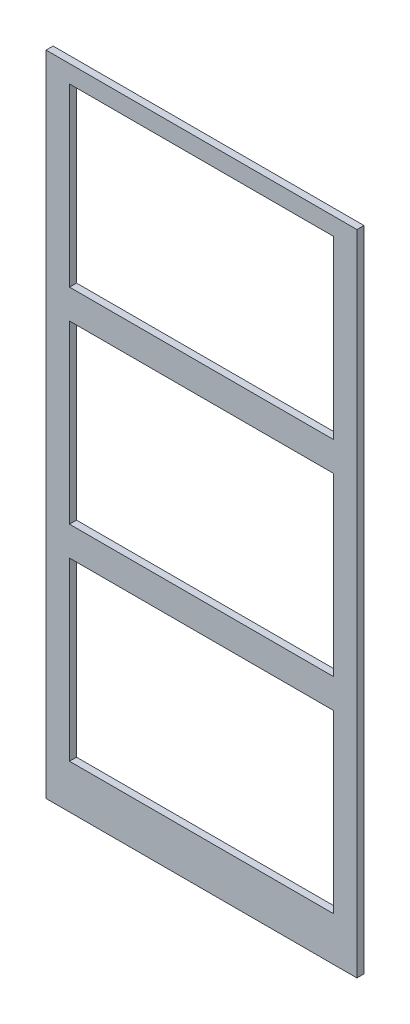
ISO-10303-21;
HEADER;
FILE_DESCRIPTION(('STEP AP214'),'2;1');
FILE_NAME('part.step','',(''),(''),'','','');
FILE_SCHEMA(('AUTOMOTIVE_DESIGN { 1 0 10303 214 1 1 1 1 }'));
ENDSEC;
DATA;
#1=APPLICATION_CONTEXT('core data for automotive mechanical design processes');
#2=APPLICATION_PROTOCOL_DEFINITION('international standard','automotive_design',2000,#1);
#3=PRODUCT_CONTEXT('',#1,'mechanical');
#4=PRODUCT('Part','Part','',(#3));
#5=PRODUCT_RELATED_PRODUCT_CATEGORY('part','',(#4));
#6=PRODUCT_DEFINITION_FORMATION('','',#4);
#7=PRODUCT_DEFINITION_CONTEXT('part definition',#1,'design');
#8=PRODUCT_DEFINITION('design','',#6,#7);
#9=PRODUCT_DEFINITION_SHAPE('','',#8);
#10=(LENGTH_UNIT() NAMED_UNIT(*) SI_UNIT(.MILLI.,.METRE.));
#11=(NAMED_UNIT(*) PLANE_ANGLE_UNIT() SI_UNIT($,.RADIAN.));
#12=(NAMED_UNIT(*) SI_UNIT($,.STERADIAN.) SOLID_ANGLE_UNIT());
#13=UNCERTAINTY_MEASURE_WITH_UNIT(LENGTH_MEASURE(1.E-05),#10,'distance_accuracy_value','');
#14=(GEOMETRIC_REPRESENTATION_CONTEXT(3) GLOBAL_UNCERTAINTY_ASSIGNED_CONTEXT((#13)) GLOBAL_UNIT_ASSIGNED_CONTEXT((#10,
#11,#12)) REPRESENTATION_CONTEXT('',''));
#15=CARTESIAN_POINT('',(0.,0.,0.));
#16=DIRECTION('',(0.,0.,1.));
#17=DIRECTION('',(1.,0.,0.));
#18=AXIS2_PLACEMENT_3D('',#15,#16,#17);
#19=CARTESIAN_POINT('',(0.,0.,6.));
#20=DIRECTION('',(0.,0.,-1.));
#21=DIRECTION('',(-1.,0.,0.));
#22=AXIS2_PLACEMENT_3D('',#19,#20,#21);
#23=PLANE('',#22);
#24=DIRECTION('',(0.,-1.,0.));
#25=VECTOR('',#24,1.);
#26=CARTESIAN_POINT('',(22.2502724046891,211.57741922363,6.));
#27=LINE('',#26,#25);
#28=CARTESIAN_POINT('',(22.2502724046891,361.57741922363,6.));
#29=VERTEX_POINT('',#28);
#30=CARTESIAN_POINT('',(22.2502724046891,211.57741922363,6.));
#31=VERTEX_POINT('',#30);
#32=EDGE_CURVE('E183',#29,#31,#27,.T.);
#33=ORIENTED_EDGE('',*,*,#32,.F.);
#34=DIRECTION('',(-1.,0.,0.));
#35=VECTOR('',#34,1.);
#36=CARTESIAN_POINT('',(22.2502724046891,361.57741922363,6.));
#37=LINE('',#36,#35);
#38=CARTESIAN_POINT('',(247.250272404689,361.57741922363,6.));
#39=VERTEX_POINT('',#38);
#40=EDGE_CURVE('E191',#39,#29,#37,.T.);
#41=ORIENTED_EDGE('',*,*,#40,.F.);
#42=DIRECTION('',(0.,1.,0.));
#43=VECTOR('',#42,1.);
#44=CARTESIAN_POINT('',(247.250272404689,211.57741922363,6.));
#45=LINE('',#44,#43);
#46=CARTESIAN_POINT('',(247.250272404689,211.57741922363,6.));
#47=VERTEX_POINT('',#46);
#48=EDGE_CURVE('E188',#47,#39,#45,.T.);
#49=ORIENTED_EDGE('',*,*,#48,.F.);
#50=DIRECTION('',(1.,0.,0.));
#51=VECTOR('',#50,1.);
#52=CARTESIAN_POINT('',(22.2502724046891,211.57741922363,6.));
#53=LINE('',#52,#51);
#54=EDGE_CURVE('E185',#31,#47,#53,.T.);
#55=ORIENTED_EDGE('',*,*,#54,.F.);
#56=EDGE_LOOP('',(#33,#41,#49,#55));
#57=FACE_BOUND('',#56,.T.);
#58=DIRECTION('',(0.,-1.,0.));
#59=VECTOR('',#58,1.);
#60=CARTESIAN_POINT('',(2.25027240468913,-0.92258077637028,6.));
#61=LINE('',#60,#59);
#62=CARTESIAN_POINT('',(2.25027240468913,551.57741922363,6.));
#63=VERTEX_POINT('',#62);
#64=CARTESIAN_POINT('',(2.25027240468913,-0.92258077637028,6.));
#65=VERTEX_POINT('',#64);
#66=EDGE_CURVE('E245',#63,#65,#61,.T.);
#67=ORIENTED_EDGE('',*,*,#66,.T.);
#68=DIRECTION('',(1.,0.,0.));
#69=VECTOR('',#68,1.);
#70=CARTESIAN_POINT('',(2.25027240468913,-0.92258077637028,6.));
#71=LINE('',#70,#69);
#72=CARTESIAN_POINT('',(267.250272404689,-0.92258077637028,6.));
#73=VERTEX_POINT('',#72);
#74=EDGE_CURVE('E248',#65,#73,#71,.T.);
#75=ORIENTED_EDGE('',*,*,#74,.T.);
#76=DIRECTION('',(0.,1.,0.));
#77=VECTOR('',#76,1.);
#78=CARTESIAN_POINT('',(267.250272404689,-0.92258077637028,6.));
#79=LINE('',#78,#77);
#80=CARTESIAN_POINT('',(267.250272404689,551.57741922363,6.));
#81=VERTEX_POINT('',#80);
#82=EDGE_CURVE('E251',#73,#81,#79,.T.);
#83=ORIENTED_EDGE('',*,*,#82,.T.);
#84=DIRECTION('',(-1.,0.,0.));
#85=VECTOR('',#84,1.);
#86=CARTESIAN_POINT('',(2.25027240468913,551.57741922363,6.));
#87=LINE('',#86,#85);
#88=EDGE_CURVE('E253',#81,#63,#87,.T.);
#89=ORIENTED_EDGE('',*,*,#88,.T.);
#90=EDGE_LOOP('',(#67,#75,#83,#89));
#91=FACE_BOUND('',#90,.T.);
#92=DIRECTION('',(0.,-1.,0.));
#93=VECTOR('',#92,1.);
#94=CARTESIAN_POINT('',(22.2502724046891,36.5774192236303,6.));
#95=LINE('',#94,#93);
#96=CARTESIAN_POINT('',(22.2502724046891,186.57741922363,6.));
#97=VERTEX_POINT('',#96);
#98=CARTESIAN_POINT('',(22.2502724046891,36.5774192236303,6.));
#99=VERTEX_POINT('',#98);
#100=EDGE_CURVE('E214',#97,#99,#95,.T.);
#101=ORIENTED_EDGE('',*,*,#100,.F.);
#102=DIRECTION('',(-1.,0.,0.));
#103=VECTOR('',#102,1.);
#104=CARTESIAN_POINT('',(22.2502724046891,186.57741922363,6.));
#105=LINE('',#104,#103);
#106=CARTESIAN_POINT('',(247.250272404689,186.57741922363,6.));
#107=VERTEX_POINT('',#106);
#108=EDGE_CURVE('E222',#107,#97,#105,.T.);
#109=ORIENTED_EDGE('',*,*,#108,.F.);
#110=DIRECTION('',(0.,1.,0.));
#111=VECTOR('',#110,1.);
#112=CARTESIAN_POINT('',(247.250272404689,36.5774192236297,6.));
#113=LINE('',#112,#111);
#114=CARTESIAN_POINT('',(247.250272404689,36.5774192236297,6.));
#115=VERTEX_POINT('',#114);
#116=EDGE_CURVE('E219',#115,#107,#113,.T.);
#117=ORIENTED_EDGE('',*,*,#116,.F.);
#118=DIRECTION('',(1.,0.,0.));
#119=VECTOR('',#118,1.);
#120=CARTESIAN_POINT('',(22.2502724046891,36.5774192236303,6.));
#121=LINE('',#120,#119);
#122=EDGE_CURVE('E216',#99,#115,#121,.T.);
#123=ORIENTED_EDGE('',*,*,#122,.F.);
#124=EDGE_LOOP('',(#101,#109,#117,#123));
#125=FACE_BOUND('',#124,.T.);
#126=DIRECTION('',(0.,-1.,0.));
#127=VECTOR('',#126,1.);
#128=CARTESIAN_POINT('',(22.2502724046891,386.57741922363,6.));
#129=LINE('',#128,#127);
#130=CARTESIAN_POINT('',(22.2502724046891,536.57741922363,6.));
#131=VERTEX_POINT('',#130);
#132=CARTESIAN_POINT('',(22.2502724046891,386.57741922363,6.));
#133=VERTEX_POINT('',#132);
#134=EDGE_CURVE('E147',#131,#133,#129,.T.);
#135=ORIENTED_EDGE('',*,*,#134,.F.);
#136=DIRECTION('',(-1.,0.,0.));
#137=VECTOR('',#136,1.);
#138=CARTESIAN_POINT('',(22.2502724046891,536.57741922363,6.));
#139=LINE('',#138,#137);
#140=CARTESIAN_POINT('',(247.250272404689,536.57741922363,6.));
#141=VERTEX_POINT('',#140);
#142=EDGE_CURVE('E169',#141,#131,#139,.T.);
#143=ORIENTED_EDGE('',*,*,#142,.F.);
#144=DIRECTION('',(0.,1.,0.));
#145=VECTOR('',#144,1.);
#146=CARTESIAN_POINT('',(247.250272404689,386.57741922363,6.));
#147=LINE('',#146,#145);
#148=CARTESIAN_POINT('',(247.250272404689,386.57741922363,6.));
#149=VERTEX_POINT('',#148);
#150=EDGE_CURVE('E167',#149,#141,#147,.T.);
#151=ORIENTED_EDGE('',*,*,#150,.F.);
#152=DIRECTION('',(1.,0.,0.));
#153=VECTOR('',#152,1.);
#154=CARTESIAN_POINT('',(22.2502724046891,386.57741922363,6.));
#155=LINE('',#154,#153);
#156=EDGE_CURVE('E155',#133,#149,#155,.T.);
#157=ORIENTED_EDGE('',*,*,#156,.F.);
#158=EDGE_LOOP('',(#135,#143,#151,#157));
#159=FACE_BOUND('',#158,.T.);
#160=ADVANCED_FACE('F34',(#57,#91,#125,#159),#23,.F.);
#161=CARTESIAN_POINT('',(0.,0.,0.));
#162=DIRECTION('',(0.,0.,-1.));
#163=DIRECTION('',(-1.,0.,0.));
#164=AXIS2_PLACEMENT_3D('',#161,#162,#163);
#165=PLANE('',#164);
#166=DIRECTION('',(0.,-1.,0.));
#167=VECTOR('',#166,1.);
#168=CARTESIAN_POINT('',(2.25027240468913,-0.92258077637028,0.));
#169=LINE('',#168,#167);
#170=CARTESIAN_POINT('',(2.25027240468913,551.57741922363,0.));
#171=VERTEX_POINT('',#170);
#172=CARTESIAN_POINT('',(2.25027240468913,-0.92258077637028,0.));
#173=VERTEX_POINT('',#172);
#174=EDGE_CURVE('E244',#171,#173,#169,.T.);
#175=ORIENTED_EDGE('',*,*,#174,.F.);
#176=DIRECTION('',(-1.,0.,0.));
#177=VECTOR('',#176,1.);
#178=CARTESIAN_POINT('',(2.25027240468913,551.57741922363,0.));
#179=LINE('',#178,#177);
#180=CARTESIAN_POINT('',(267.250272404689,551.57741922363,0.));
#181=VERTEX_POINT('',#180);
#182=EDGE_CURVE('E249',#181,#171,#179,.T.);
#183=ORIENTED_EDGE('',*,*,#182,.F.);
#184=DIRECTION('',(0.,1.,0.));
#185=VECTOR('',#184,1.);
#186=CARTESIAN_POINT('',(267.250272404689,-0.92258077637028,0.));
#187=LINE('',#186,#185);
#188=CARTESIAN_POINT('',(267.250272404689,-0.92258077637028,0.));
#189=VERTEX_POINT('',#188);
#190=EDGE_CURVE('E260',#189,#181,#187,.T.);
#191=ORIENTED_EDGE('',*,*,#190,.F.);
#192=DIRECTION('',(1.,0.,0.));
#193=VECTOR('',#192,1.);
#194=CARTESIAN_POINT('',(2.25027240468913,-0.92258077637028,0.));
#195=LINE('',#194,#193);
#196=EDGE_CURVE('E258',#173,#189,#195,.T.);
#197=ORIENTED_EDGE('',*,*,#196,.F.);
#198=EDGE_LOOP('',(#175,#183,#191,#197));
#199=FACE_BOUND('',#198,.T.);
#200=DIRECTION('',(-1.,0.,0.));
#201=VECTOR('',#200,1.);
#202=CARTESIAN_POINT('',(22.2502724046891,186.57741922363,0.));
#203=LINE('',#202,#201);
#204=CARTESIAN_POINT('',(247.250272404689,186.57741922363,0.));
#205=VERTEX_POINT('',#204);
#206=CARTESIAN_POINT('',(22.2502724046891,186.57741922363,0.));
#207=VERTEX_POINT('',#206);
#208=EDGE_CURVE('E217',#205,#207,#203,.T.);
#209=ORIENTED_EDGE('',*,*,#208,.T.);
#210=DIRECTION('',(0.,-1.,0.));
#211=VECTOR('',#210,1.);
#212=CARTESIAN_POINT('',(22.2502724046891,36.5774192236303,0.));
#213=LINE('',#212,#211);
#214=CARTESIAN_POINT('',(22.2502724046891,36.5774192236303,0.));
#215=VERTEX_POINT('',#214);
#216=EDGE_CURVE('E213',#207,#215,#213,.T.);
#217=ORIENTED_EDGE('',*,*,#216,.T.);
#218=DIRECTION('',(1.,0.,0.));
#219=VECTOR('',#218,1.);
#220=CARTESIAN_POINT('',(22.2502724046891,36.5774192236303,0.));
#221=LINE('',#220,#219);
#222=CARTESIAN_POINT('',(247.250272404689,36.5774192236297,0.));
#223=VERTEX_POINT('',#222);
#224=EDGE_CURVE('E227',#215,#223,#221,.T.);
#225=ORIENTED_EDGE('',*,*,#224,.T.);
#226=DIRECTION('',(0.,1.,0.));
#227=VECTOR('',#226,1.);
#228=CARTESIAN_POINT('',(247.250272404689,36.5774192236297,0.));
#229=LINE('',#228,#227);
#230=EDGE_CURVE('E230',#223,#205,#229,.T.);
#231=ORIENTED_EDGE('',*,*,#230,.T.);
#232=EDGE_LOOP('',(#209,#217,#225,#231));
#233=FACE_BOUND('',#232,.T.);
#234=DIRECTION('',(-1.,0.,0.));
#235=VECTOR('',#234,1.);
#236=CARTESIAN_POINT('',(22.2502724046891,361.57741922363,0.));
#237=LINE('',#236,#235);
#238=CARTESIAN_POINT('',(247.250272404689,361.57741922363,0.));
#239=VERTEX_POINT('',#238);
#240=CARTESIAN_POINT('',(22.2502724046891,361.57741922363,0.));
#241=VERTEX_POINT('',#240);
#242=EDGE_CURVE('E186',#239,#241,#237,.T.);
#243=ORIENTED_EDGE('',*,*,#242,.T.);
#244=DIRECTION('',(0.,-1.,0.));
#245=VECTOR('',#244,1.);
#246=CARTESIAN_POINT('',(22.2502724046891,211.57741922363,0.));
#247=LINE('',#246,#245);
#248=CARTESIAN_POINT('',(22.2502724046891,211.57741922363,0.));
#249=VERTEX_POINT('',#248);
#250=EDGE_CURVE('E163',#241,#249,#247,.T.);
#251=ORIENTED_EDGE('',*,*,#250,.T.);
#252=DIRECTION('',(1.,0.,0.));
#253=VECTOR('',#252,1.);
#254=CARTESIAN_POINT('',(22.2502724046891,211.57741922363,0.));
#255=LINE('',#254,#253);
#256=CARTESIAN_POINT('',(247.250272404689,211.57741922363,0.));
#257=VERTEX_POINT('',#256);
#258=EDGE_CURVE('E196',#249,#257,#255,.T.);
#259=ORIENTED_EDGE('',*,*,#258,.T.);
#260=DIRECTION('',(0.,1.,0.));
#261=VECTOR('',#260,1.);
#262=CARTESIAN_POINT('',(247.250272404689,211.57741922363,0.));
#263=LINE('',#262,#261);
#264=EDGE_CURVE('E199',#257,#239,#263,.T.);
#265=ORIENTED_EDGE('',*,*,#264,.T.);
#266=EDGE_LOOP('',(#243,#251,#259,#265));
#267=FACE_BOUND('',#266,.T.);
#268=DIRECTION('',(-1.,0.,0.));
#269=VECTOR('',#268,1.);
#270=CARTESIAN_POINT('',(22.2502724046891,536.57741922363,0.));
#271=LINE('',#270,#269);
#272=CARTESIAN_POINT('',(247.250272404689,536.57741922363,0.));
#273=VERTEX_POINT('',#272);
#274=CARTESIAN_POINT('',(22.2502724046891,536.57741922363,0.));
#275=VERTEX_POINT('',#274);
#276=EDGE_CURVE('E156',#273,#275,#271,.T.);
#277=ORIENTED_EDGE('',*,*,#276,.T.);
#278=DIRECTION('',(0.,-1.,0.));
#279=VECTOR('',#278,1.);
#280=CARTESIAN_POINT('',(22.2502724046891,386.57741922363,0.));
#281=LINE('',#280,#279);
#282=CARTESIAN_POINT('',(22.2502724046891,386.57741922363,0.));
#283=VERTEX_POINT('',#282);
#284=EDGE_CURVE('E57',#275,#283,#281,.T.);
#285=ORIENTED_EDGE('',*,*,#284,.T.);
#286=DIRECTION('',(1.,0.,0.));
#287=VECTOR('',#286,1.);
#288=CARTESIAN_POINT('',(22.2502724046891,386.57741922363,0.));
#289=LINE('',#288,#287);
#290=CARTESIAN_POINT('',(247.250272404689,386.57741922363,0.));
#291=VERTEX_POINT('',#290);
#292=EDGE_CURVE('E162',#283,#291,#289,.T.);
#293=ORIENTED_EDGE('',*,*,#292,.T.);
#294=DIRECTION('',(0.,1.,0.));
#295=VECTOR('',#294,1.);
#296=CARTESIAN_POINT('',(247.250272404689,386.57741922363,0.));
#297=LINE('',#296,#295);
#298=EDGE_CURVE('E175',#291,#273,#297,.T.);
#299=ORIENTED_EDGE('',*,*,#298,.T.);
#300=EDGE_LOOP('',(#277,#285,#293,#299));
#301=FACE_BOUND('',#300,.T.);
#302=ADVANCED_FACE('F278',(#199,#233,#267,#301),#165,.T.);
#303=CARTESIAN_POINT('',(2.25027240468913,-0.92258077637028,6.));
#304=DIRECTION('',(1.,0.,0.));
#305=DIRECTION('',(0.,0.,-1.));
#306=AXIS2_PLACEMENT_3D('',#303,#304,#305);
#307=PLANE('',#306);
#308=ORIENTED_EDGE('',*,*,#174,.T.);
#309=DIRECTION('',(0.,0.,-1.));
#310=VECTOR('',#309,1.);
#311=CARTESIAN_POINT('',(2.25027240468913,-0.92258077637028,6.));
#312=LINE('',#311,#310);
#313=EDGE_CURVE('E11',#65,#173,#312,.T.);
#314=ORIENTED_EDGE('',*,*,#313,.F.);
#315=ORIENTED_EDGE('',*,*,#66,.F.);
#316=DIRECTION('',(0.,0.,-1.));
#317=VECTOR('',#316,1.);
#318=CARTESIAN_POINT('',(2.25027240468913,551.57741922363,6.));
#319=LINE('',#318,#317);
#320=EDGE_CURVE('E255',#63,#171,#319,.T.);
#321=ORIENTED_EDGE('',*,*,#320,.T.);
#322=EDGE_LOOP('',(#308,#314,#315,#321));
#323=FACE_BOUND('',#322,.T.);
#324=ADVANCED_FACE('F36',(#323),#307,.F.);
#325=CARTESIAN_POINT('',(2.25027240468913,-0.92258077637028,6.));
#326=DIRECTION('',(0.,1.,0.));
#327=DIRECTION('',(0.,0.,1.));
#328=AXIS2_PLACEMENT_3D('',#325,#326,#327);
#329=PLANE('',#328);
#330=ORIENTED_EDGE('',*,*,#196,.T.);
#331=DIRECTION('',(0.,0.,-1.));
#332=VECTOR('',#331,1.);
#333=CARTESIAN_POINT('',(267.250272404689,-0.92258077637028,6.));
#334=LINE('',#333,#332);
#335=EDGE_CURVE('E42',#73,#189,#334,.T.);
#336=ORIENTED_EDGE('',*,*,#335,.F.);
#337=ORIENTED_EDGE('',*,*,#74,.F.);
#338=ORIENTED_EDGE('',*,*,#313,.T.);
#339=EDGE_LOOP('',(#330,#336,#337,#338));
#340=FACE_BOUND('',#339,.T.);
#341=ADVANCED_FACE('F289',(#340),#329,.F.);
#342=CARTESIAN_POINT('',(267.250272404689,-0.92258077637028,6.));
#343=DIRECTION('',(-1.,0.,0.));
#344=DIRECTION('',(0.,0.,1.));
#345=AXIS2_PLACEMENT_3D('',#342,#343,#344);
#346=PLANE('',#345);
#347=ORIENTED_EDGE('',*,*,#190,.T.);
#348=DIRECTION('',(0.,0.,-1.));
#349=VECTOR('',#348,1.);
#350=CARTESIAN_POINT('',(267.250272404689,551.57741922363,6.));
#351=LINE('',#350,#349);
#352=EDGE_CURVE('E265',#81,#181,#351,.T.);
#353=ORIENTED_EDGE('',*,*,#352,.F.);
#354=ORIENTED_EDGE('',*,*,#82,.F.);
#355=ORIENTED_EDGE('',*,*,#335,.T.);
#356=EDGE_LOOP('',(#347,#353,#354,#355));
#357=FACE_BOUND('',#356,.T.);
#358=ADVANCED_FACE('F272',(#357),#346,.F.);
#359=CARTESIAN_POINT('',(2.25027240468913,551.57741922363,6.));
#360=DIRECTION('',(0.,-1.,0.));
#361=DIRECTION('',(0.,0.,-1.));
#362=AXIS2_PLACEMENT_3D('',#359,#360,#361);
#363=PLANE('',#362);
#364=ORIENTED_EDGE('',*,*,#182,.T.);
#365=ORIENTED_EDGE('',*,*,#320,.F.);
#366=ORIENTED_EDGE('',*,*,#88,.F.);
#367=ORIENTED_EDGE('',*,*,#352,.T.);
#368=EDGE_LOOP('',(#364,#365,#366,#367));
#369=FACE_BOUND('',#368,.T.);
#370=ADVANCED_FACE('F282',(#369),#363,.F.);
#371=CARTESIAN_POINT('',(22.2502724046891,36.5774192236303,6.));
#372=DIRECTION('',(1.,0.,0.));
#373=DIRECTION('',(0.,0.,-1.));
#374=AXIS2_PLACEMENT_3D('',#371,#372,#373);
#375=PLANE('',#374);
#376=ORIENTED_EDGE('',*,*,#216,.F.);
#377=DIRECTION('',(0.,0.,-1.));
#378=VECTOR('',#377,1.);
#379=CARTESIAN_POINT('',(22.2502724046891,186.57741922363,6.));
#380=LINE('',#379,#378);
#381=EDGE_CURVE('E224',#97,#207,#380,.T.);
#382=ORIENTED_EDGE('',*,*,#381,.F.);
#383=ORIENTED_EDGE('',*,*,#100,.T.);
#384=DIRECTION('',(0.,0.,-1.));
#385=VECTOR('',#384,1.);
#386=CARTESIAN_POINT('',(22.2502724046891,36.5774192236303,6.));
#387=LINE('',#386,#385);
#388=EDGE_CURVE('E241',#99,#215,#387,.T.);
#389=ORIENTED_EDGE('',*,*,#388,.T.);
#390=EDGE_LOOP('',(#376,#382,#383,#389));
#391=FACE_BOUND('',#390,.T.);
#392=ADVANCED_FACE('F305',(#391),#375,.T.);
#393=CARTESIAN_POINT('',(22.2502724046891,36.5774192236303,6.));
#394=DIRECTION('',(0.,1.,0.));
#395=DIRECTION('',(-1.,0.,0.));
#396=AXIS2_PLACEMENT_3D('',#393,#394,#395);
#397=PLANE('',#396);
#398=ORIENTED_EDGE('',*,*,#224,.F.);
#399=ORIENTED_EDGE('',*,*,#388,.F.);
#400=ORIENTED_EDGE('',*,*,#122,.T.);
#401=DIRECTION('',(0.,0.,-1.));
#402=VECTOR('',#401,1.);
#403=CARTESIAN_POINT('',(247.250272404689,36.5774192236297,6.));
#404=LINE('',#403,#402);
#405=EDGE_CURVE('E239',#115,#223,#404,.T.);
#406=ORIENTED_EDGE('',*,*,#405,.T.);
#407=EDGE_LOOP('',(#398,#399,#400,#406));
#408=FACE_BOUND('',#407,.T.);
#409=ADVANCED_FACE('F312',(#408),#397,.T.);
#410=CARTESIAN_POINT('',(247.250272404689,36.5774192236297,6.));
#411=DIRECTION('',(-1.,0.,0.));
#412=DIRECTION('',(0.,0.,1.));
#413=AXIS2_PLACEMENT_3D('',#410,#411,#412);
#414=PLANE('',#413);
#415=ORIENTED_EDGE('',*,*,#230,.F.);
#416=ORIENTED_EDGE('',*,*,#405,.F.);
#417=ORIENTED_EDGE('',*,*,#116,.T.);
#418=DIRECTION('',(0.,0.,-1.));
#419=VECTOR('',#418,1.);
#420=CARTESIAN_POINT('',(247.250272404689,186.57741922363,6.));
#421=LINE('',#420,#419);
#422=EDGE_CURVE('E237',#107,#205,#421,.T.);
#423=ORIENTED_EDGE('',*,*,#422,.T.);
#424=EDGE_LOOP('',(#415,#416,#417,#423));
#425=FACE_BOUND('',#424,.T.);
#426=ADVANCED_FACE('F317',(#425),#414,.T.);
#427=CARTESIAN_POINT('',(22.2502724046891,186.57741922363,6.));
#428=DIRECTION('',(0.,-1.,0.));
#429=DIRECTION('',(0.,0.,-1.));
#430=AXIS2_PLACEMENT_3D('',#427,#428,#429);
#431=PLANE('',#430);
#432=ORIENTED_EDGE('',*,*,#208,.F.);
#433=ORIENTED_EDGE('',*,*,#422,.F.);
#434=ORIENTED_EDGE('',*,*,#108,.T.);
#435=ORIENTED_EDGE('',*,*,#381,.T.);
#436=EDGE_LOOP('',(#432,#433,#434,#435));
#437=FACE_BOUND('',#436,.T.);
#438=ADVANCED_FACE('F324',(#437),#431,.T.);
#439=CARTESIAN_POINT('',(22.2502724046891,211.57741922363,6.));
#440=DIRECTION('',(1.,0.,0.));
#441=DIRECTION('',(0.,0.,-1.));
#442=AXIS2_PLACEMENT_3D('',#439,#440,#441);
#443=PLANE('',#442);
#444=ORIENTED_EDGE('',*,*,#250,.F.);
#445=DIRECTION('',(0.,0.,-1.));
#446=VECTOR('',#445,1.);
#447=CARTESIAN_POINT('',(22.2502724046891,361.57741922363,6.));
#448=LINE('',#447,#446);
#449=EDGE_CURVE('E193',#29,#241,#448,.T.);
#450=ORIENTED_EDGE('',*,*,#449,.F.);
#451=ORIENTED_EDGE('',*,*,#32,.T.);
#452=DIRECTION('',(0.,0.,-1.));
#453=VECTOR('',#452,1.);
#454=CARTESIAN_POINT('',(22.2502724046891,211.57741922363,6.));
#455=LINE('',#454,#453);
#456=EDGE_CURVE('E210',#31,#249,#455,.T.);
#457=ORIENTED_EDGE('',*,*,#456,.T.);
#458=EDGE_LOOP('',(#444,#450,#451,#457));
#459=FACE_BOUND('',#458,.T.);
#460=ADVANCED_FACE('F337',(#459),#443,.T.);
#461=CARTESIAN_POINT('',(22.2502724046891,211.57741922363,6.));
#462=DIRECTION('',(0.,1.,0.));
#463=DIRECTION('',(0.,0.,1.));
#464=AXIS2_PLACEMENT_3D('',#461,#462,#463);
#465=PLANE('',#464);
#466=ORIENTED_EDGE('',*,*,#258,.F.);
#467=ORIENTED_EDGE('',*,*,#456,.F.);
#468=ORIENTED_EDGE('',*,*,#54,.T.);
#469=DIRECTION('',(0.,0.,-1.));
#470=VECTOR('',#469,1.);
#471=CARTESIAN_POINT('',(247.250272404689,211.57741922363,6.));
#472=LINE('',#471,#470);
#473=EDGE_CURVE('E208',#47,#257,#472,.T.);
#474=ORIENTED_EDGE('',*,*,#473,.T.);
#475=EDGE_LOOP('',(#466,#467,#468,#474));
#476=FACE_BOUND('',#475,.T.);
#477=ADVANCED_FACE('F342',(#476),#465,.T.);
#478=CARTESIAN_POINT('',(247.250272404689,211.57741922363,6.));
#479=DIRECTION('',(-1.,0.,0.));
#480=DIRECTION('',(0.,0.,1.));
#481=AXIS2_PLACEMENT_3D('',#478,#479,#480);
#482=PLANE('',#481);
#483=ORIENTED_EDGE('',*,*,#264,.F.);
#484=ORIENTED_EDGE('',*,*,#473,.F.);
#485=ORIENTED_EDGE('',*,*,#48,.T.);
#486=DIRECTION('',(0.,0.,-1.));
#487=VECTOR('',#486,1.);
#488=CARTESIAN_POINT('',(247.250272404689,361.57741922363,6.));
#489=LINE('',#488,#487);
#490=EDGE_CURVE('E206',#39,#239,#489,.T.);
#491=ORIENTED_EDGE('',*,*,#490,.T.);
#492=EDGE_LOOP('',(#483,#484,#485,#491));
#493=FACE_BOUND('',#492,.T.);
#494=ADVANCED_FACE('F346',(#493),#482,.T.);
#495=CARTESIAN_POINT('',(22.2502724046891,361.57741922363,6.));
#496=DIRECTION('',(0.,-1.,0.));
#497=DIRECTION('',(0.,0.,-1.));
#498=AXIS2_PLACEMENT_3D('',#495,#496,#497);
#499=PLANE('',#498);
#500=ORIENTED_EDGE('',*,*,#242,.F.);
#501=ORIENTED_EDGE('',*,*,#490,.F.);
#502=ORIENTED_EDGE('',*,*,#40,.T.);
#503=ORIENTED_EDGE('',*,*,#449,.T.);
#504=EDGE_LOOP('',(#500,#501,#502,#503));
#505=FACE_BOUND('',#504,.T.);
#506=ADVANCED_FACE('F350',(#505),#499,.T.);
#507=CARTESIAN_POINT('',(22.2502724046891,386.57741922363,6.));
#508=DIRECTION('',(1.,0.,0.));
#509=DIRECTION('',(0.,0.,-1.));
#510=AXIS2_PLACEMENT_3D('',#507,#508,#509);
#511=PLANE('',#510);
#512=ORIENTED_EDGE('',*,*,#284,.F.);
#513=DIRECTION('',(0.,0.,-1.));
#514=VECTOR('',#513,1.);
#515=CARTESIAN_POINT('',(22.2502724046891,536.57741922363,6.));
#516=LINE('',#515,#514);
#517=EDGE_CURVE('E151',#131,#275,#516,.T.);
#518=ORIENTED_EDGE('',*,*,#517,.F.);
#519=ORIENTED_EDGE('',*,*,#134,.T.);
#520=DIRECTION('',(0.,0.,-1.));
#521=VECTOR('',#520,1.);
#522=CARTESIAN_POINT('',(22.2502724046891,386.57741922363,6.));
#523=LINE('',#522,#521);
#524=EDGE_CURVE('E150',#133,#283,#523,.T.);
#525=ORIENTED_EDGE('',*,*,#524,.T.);
#526=EDGE_LOOP('',(#512,#518,#519,#525));
#527=FACE_BOUND('',#526,.T.);
#528=ADVANCED_FACE('F149',(#527),#511,.T.);
#529=CARTESIAN_POINT('',(22.2502724046891,386.57741922363,6.));
#530=DIRECTION('',(0.,1.,0.));
#531=DIRECTION('',(0.,0.,1.));
#532=AXIS2_PLACEMENT_3D('',#529,#530,#531);
#533=PLANE('',#532);
#534=ORIENTED_EDGE('',*,*,#292,.F.);
#535=ORIENTED_EDGE('',*,*,#524,.F.);
#536=ORIENTED_EDGE('',*,*,#156,.T.);
#537=DIRECTION('',(0.,0.,-1.));
#538=VECTOR('',#537,1.);
#539=CARTESIAN_POINT('',(247.250272404689,386.57741922363,6.));
#540=LINE('',#539,#538);
#541=EDGE_CURVE('E164',#149,#291,#540,.T.);
#542=ORIENTED_EDGE('',*,*,#541,.T.);
#543=EDGE_LOOP('',(#534,#535,#536,#542));
#544=FACE_BOUND('',#543,.T.);
#545=ADVANCED_FACE('F159',(#544),#533,.T.);
#546=CARTESIAN_POINT('',(247.250272404689,386.57741922363,6.));
#547=DIRECTION('',(-1.,0.,0.));
#548=DIRECTION('',(0.,0.,1.));
#549=AXIS2_PLACEMENT_3D('',#546,#547,#548);
#550=PLANE('',#549);
#551=ORIENTED_EDGE('',*,*,#298,.F.);
#552=ORIENTED_EDGE('',*,*,#541,.F.);
#553=ORIENTED_EDGE('',*,*,#150,.T.);
#554=DIRECTION('',(0.,0.,-1.));
#555=VECTOR('',#554,1.);
#556=CARTESIAN_POINT('',(247.250272404689,536.57741922363,6.));
#557=LINE('',#556,#555);
#558=EDGE_CURVE('E49',#141,#273,#557,.T.);
#559=ORIENTED_EDGE('',*,*,#558,.T.);
#560=EDGE_LOOP('',(#551,#552,#553,#559));
#561=FACE_BOUND('',#560,.T.);
#562=ADVANCED_FACE('F359',(#561),#550,.T.);
#563=CARTESIAN_POINT('',(22.2502724046891,536.57741922363,6.));
#564=DIRECTION('',(0.,-1.,0.));
#565=DIRECTION('',(0.,0.,-1.));
#566=AXIS2_PLACEMENT_3D('',#563,#564,#565);
#567=PLANE('',#566);
#568=ORIENTED_EDGE('',*,*,#276,.F.);
#569=ORIENTED_EDGE('',*,*,#558,.F.);
#570=ORIENTED_EDGE('',*,*,#142,.T.);
#571=ORIENTED_EDGE('',*,*,#517,.T.);
#572=EDGE_LOOP('',(#568,#569,#570,#571));
#573=FACE_BOUND('',#572,.T.);
#574=ADVANCED_FACE('F362',(#573),#567,.T.);
#575=CLOSED_SHELL('',(#160,#302,#324,#341,#358,#370,#392,#409,#426,#438,#460,#477,#494,#506,
#528,#545,#562,#574));
#576=MANIFOLD_SOLID_BREP('B2',#575);
#577=ADVANCED_BREP_SHAPE_REPRESENTATION('',(#18,#576),#14);
#578=SHAPE_DEFINITION_REPRESENTATION(#9,#577);
ENDSEC;
END-ISO-10303-21;
